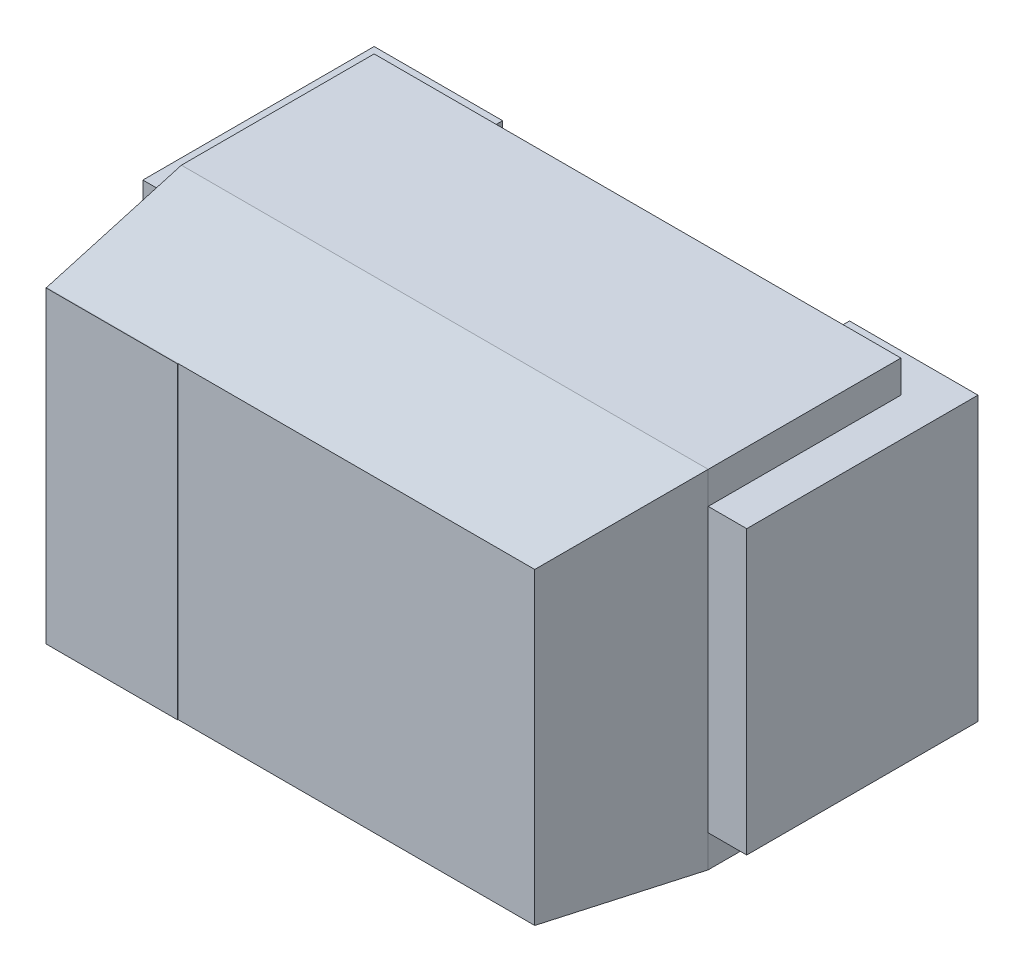
ISO-10303-21;
HEADER;
FILE_DESCRIPTION(('STEP AP214'),'2;1');
FILE_NAME('part.step','',(''),(''),'','','');
FILE_SCHEMA(('AUTOMOTIVE_DESIGN { 1 0 10303 214 1 1 1 1 }'));
ENDSEC;
DATA;
#1=APPLICATION_CONTEXT('core data for automotive mechanical design processes');
#2=APPLICATION_PROTOCOL_DEFINITION('international standard','automotive_design',2000,#1);
#3=PRODUCT_CONTEXT('',#1,'mechanical');
#4=PRODUCT('Part','Part','',(#3));
#5=PRODUCT_RELATED_PRODUCT_CATEGORY('part','',(#4));
#6=PRODUCT_DEFINITION_FORMATION('','',#4);
#7=PRODUCT_DEFINITION_CONTEXT('part definition',#1,'design');
#8=PRODUCT_DEFINITION('design','',#6,#7);
#9=PRODUCT_DEFINITION_SHAPE('','',#8);
#10=(LENGTH_UNIT() NAMED_UNIT(*) SI_UNIT(.MILLI.,.METRE.));
#11=(NAMED_UNIT(*) PLANE_ANGLE_UNIT() SI_UNIT($,.RADIAN.));
#12=(NAMED_UNIT(*) SI_UNIT($,.STERADIAN.) SOLID_ANGLE_UNIT());
#13=UNCERTAINTY_MEASURE_WITH_UNIT(LENGTH_MEASURE(1.E-05),#10,'distance_accuracy_value','');
#14=(GEOMETRIC_REPRESENTATION_CONTEXT(3) GLOBAL_UNCERTAINTY_ASSIGNED_CONTEXT((#13)) GLOBAL_UNIT_ASSIGNED_CONTEXT((#10,
#11,#12)) REPRESENTATION_CONTEXT('',''));
#15=CARTESIAN_POINT('',(0.,0.,0.));
#16=DIRECTION('',(0.,0.,1.));
#17=DIRECTION('',(1.,0.,0.));
#18=AXIS2_PLACEMENT_3D('',#15,#16,#17);
#19=CARTESIAN_POINT('',(-0.69375,0.,1.502));
#20=DIRECTION('',(0.,0.,1.));
#21=DIRECTION('',(1.,0.,0.));
#22=AXIS2_PLACEMENT_3D('',#19,#20,#21);
#23=PLANE('',#22);
#24=DIRECTION('',(1.,0.,0.));
#25=VECTOR('',#24,1.);
#26=CARTESIAN_POINT('',(-0.69375,0.6,1.502));
#27=LINE('',#26,#25);
#28=CARTESIAN_POINT('',(-0.4375,0.6,1.502));
#29=VERTEX_POINT('',#28);
#30=CARTESIAN_POINT('',(-0.95,0.6,1.502));
#31=VERTEX_POINT('',#30);
#32=EDGE_CURVE('E161',#29,#31,#27,.F.);
#33=ORIENTED_EDGE('',*,*,#32,.T.);
#34=DIRECTION('',(0.,1.,0.));
#35=VECTOR('',#34,1.);
#36=CARTESIAN_POINT('',(-0.95,0.,1.502));
#37=LINE('',#36,#35);
#38=CARTESIAN_POINT('',(-0.95,-0.6,1.502));
#39=VERTEX_POINT('',#38);
#40=EDGE_CURVE('E156',#31,#39,#37,.F.);
#41=ORIENTED_EDGE('',*,*,#40,.T.);
#42=DIRECTION('',(-1.,0.,0.));
#43=VECTOR('',#42,1.);
#44=CARTESIAN_POINT('',(-0.69375,-0.6,1.502));
#45=LINE('',#44,#43);
#46=CARTESIAN_POINT('',(-0.4375,-0.6,1.502));
#47=VERTEX_POINT('',#46);
#48=EDGE_CURVE('E171',#39,#47,#45,.F.);
#49=ORIENTED_EDGE('',*,*,#48,.T.);
#50=DIRECTION('',(0.,-1.,0.));
#51=VECTOR('',#50,1.);
#52=CARTESIAN_POINT('',(-0.4375,0.,1.502));
#53=LINE('',#52,#51);
#54=EDGE_CURVE('E20',#47,#29,#53,.F.);
#55=ORIENTED_EDGE('',*,*,#54,.T.);
#56=EDGE_LOOP('',(#33,#41,#49,#55));
#57=FACE_BOUND('',#56,.T.);
#58=ADVANCED_FACE('F17',(#57),#23,.T.);
#59=CARTESIAN_POINT('',(-0.4375,0.,1.501));
#60=DIRECTION('',(-1.,0.,0.));
#61=DIRECTION('',(0.,-1.,0.));
#62=AXIS2_PLACEMENT_3D('',#59,#60,#61);
#63=PLANE('',#62);
#64=DIRECTION('',(0.,1.,0.));
#65=VECTOR('',#64,1.);
#66=CARTESIAN_POINT('',(-0.4375,0.,1.5));
#67=LINE('',#66,#65);
#68=CARTESIAN_POINT('',(-0.4375,0.600000000000009,1.5));
#69=VERTEX_POINT('',#68);
#70=CARTESIAN_POINT('',(-0.4375,-0.600000000000009,1.5));
#71=VERTEX_POINT('',#70);
#72=EDGE_CURVE('E177',#69,#71,#67,.F.);
#73=ORIENTED_EDGE('',*,*,#72,.F.);
#74=DIRECTION('',(0.,0.,1.));
#75=VECTOR('',#74,1.);
#76=CARTESIAN_POINT('',(-0.4375,0.6,1.501));
#77=LINE('',#76,#75);
#78=EDGE_CURVE('E166',#69,#29,#77,.T.);
#79=ORIENTED_EDGE('',*,*,#78,.T.);
#80=ORIENTED_EDGE('',*,*,#54,.F.);
#81=DIRECTION('',(0.,0.,1.));
#82=VECTOR('',#81,1.);
#83=CARTESIAN_POINT('',(-0.4375,-0.6,1.501));
#84=LINE('',#83,#82);
#85=EDGE_CURVE('E184',#47,#71,#84,.F.);
#86=ORIENTED_EDGE('',*,*,#85,.T.);
#87=EDGE_LOOP('',(#73,#79,#80,#86));
#88=FACE_BOUND('',#87,.T.);
#89=ADVANCED_FACE('F176',(#88),#63,.F.);
#90=CARTESIAN_POINT('',(-0.69375,0.6,1.501));
#91=DIRECTION('',(0.,-1.,0.));
#92=DIRECTION('',(1.,0.,0.));
#93=AXIS2_PLACEMENT_3D('',#90,#91,#92);
#94=PLANE('',#93);
#95=DIRECTION('',(1.,0.,0.));
#96=VECTOR('',#95,1.);
#97=CARTESIAN_POINT('',(0.,0.600000000000074,1.50000000000001));
#98=LINE('',#97,#96);
#99=CARTESIAN_POINT('',(-0.950000000000009,0.600000000000009,1.5));
#100=VERTEX_POINT('',#99);
#101=EDGE_CURVE('E189',#100,#69,#98,.T.);
#102=ORIENTED_EDGE('',*,*,#101,.F.);
#103=DIRECTION('',(0.,0.,1.));
#104=VECTOR('',#103,1.);
#105=CARTESIAN_POINT('',(-0.95,0.6,1.501));
#106=LINE('',#105,#104);
#107=EDGE_CURVE('E168',#100,#31,#106,.T.);
#108=ORIENTED_EDGE('',*,*,#107,.T.);
#109=ORIENTED_EDGE('',*,*,#32,.F.);
#110=ORIENTED_EDGE('',*,*,#78,.F.);
#111=EDGE_LOOP('',(#102,#108,#109,#110));
#112=FACE_BOUND('',#111,.T.);
#113=ADVANCED_FACE('F164',(#112),#94,.F.);
#114=CARTESIAN_POINT('',(-0.95,0.,1.501));
#115=DIRECTION('',(1.,0.,0.));
#116=DIRECTION('',(0.,1.,0.));
#117=AXIS2_PLACEMENT_3D('',#114,#115,#116);
#118=PLANE('',#117);
#119=DIRECTION('',(0.,1.,0.));
#120=VECTOR('',#119,1.);
#121=CARTESIAN_POINT('',(-0.950000000000074,0.,1.50000000000001));
#122=LINE('',#121,#120);
#123=CARTESIAN_POINT('',(-0.950000000000009,-0.600000000000009,1.5));
#124=VERTEX_POINT('',#123);
#125=EDGE_CURVE('E199',#124,#100,#122,.T.);
#126=ORIENTED_EDGE('',*,*,#125,.F.);
#127=DIRECTION('',(0.,0.,1.));
#128=VECTOR('',#127,1.);
#129=CARTESIAN_POINT('',(-0.95,-0.6,1.501));
#130=LINE('',#129,#128);
#131=EDGE_CURVE('E186',#124,#39,#130,.T.);
#132=ORIENTED_EDGE('',*,*,#131,.T.);
#133=ORIENTED_EDGE('',*,*,#40,.F.);
#134=ORIENTED_EDGE('',*,*,#107,.F.);
#135=EDGE_LOOP('',(#126,#132,#133,#134));
#136=FACE_BOUND('',#135,.T.);
#137=ADVANCED_FACE('F469',(#136),#118,.F.);
#138=CARTESIAN_POINT('',(-0.69375,-0.6,1.501));
#139=DIRECTION('',(0.,1.,0.));
#140=DIRECTION('',(-1.,0.,0.));
#141=AXIS2_PLACEMENT_3D('',#138,#139,#140);
#142=PLANE('',#141);
#143=DIRECTION('',(1.,0.,0.));
#144=VECTOR('',#143,1.);
#145=CARTESIAN_POINT('',(0.,-0.600000000000074,1.50000000000001));
#146=LINE('',#145,#144);
#147=EDGE_CURVE('E207',#71,#124,#146,.F.);
#148=ORIENTED_EDGE('',*,*,#147,.F.);
#149=ORIENTED_EDGE('',*,*,#85,.F.);
#150=ORIENTED_EDGE('',*,*,#48,.F.);
#151=ORIENTED_EDGE('',*,*,#131,.F.);
#152=EDGE_LOOP('',(#148,#149,#150,#151));
#153=FACE_BOUND('',#152,.T.);
#154=ADVANCED_FACE('F465',(#153),#142,.F.);
#155=CARTESIAN_POINT('',(0.,0.,1.5));
#156=DIRECTION('',(0.,0.,1.));
#157=DIRECTION('',(1.,0.,0.));
#158=AXIS2_PLACEMENT_3D('',#155,#156,#157);
#159=PLANE('',#158);
#160=DIRECTION('',(0.,1.,0.));
#161=VECTOR('',#160,1.);
#162=CARTESIAN_POINT('',(0.950000000000074,0.,1.50000000000001));
#163=LINE('',#162,#161);
#164=CARTESIAN_POINT('',(0.950000000000019,0.600000000000019,1.5));
#165=VERTEX_POINT('',#164);
#166=CARTESIAN_POINT('',(0.950000000000019,-0.600000000000019,1.5));
#167=VERTEX_POINT('',#166);
#168=EDGE_CURVE('E212',#165,#167,#163,.F.);
#169=ORIENTED_EDGE('',*,*,#168,.F.);
#170=DIRECTION('',(1.,0.,0.));
#171=VECTOR('',#170,1.);
#172=CARTESIAN_POINT('',(0.,0.600000000000074,1.50000000000001));
#173=LINE('',#172,#171);
#174=EDGE_CURVE('E191',#69,#165,#173,.T.);
#175=ORIENTED_EDGE('',*,*,#174,.F.);
#176=ORIENTED_EDGE('',*,*,#72,.T.);
#177=DIRECTION('',(1.,0.,0.));
#178=VECTOR('',#177,1.);
#179=CARTESIAN_POINT('',(0.,-0.600000000000074,1.50000000000001));
#180=LINE('',#179,#178);
#181=EDGE_CURVE('E204',#167,#71,#180,.F.);
#182=ORIENTED_EDGE('',*,*,#181,.F.);
#183=EDGE_LOOP('',(#169,#175,#176,#182));
#184=FACE_BOUND('',#183,.T.);
#185=ADVANCED_FACE('F461',(#184),#159,.T.);
#186=CARTESIAN_POINT('',(0.,0.6375,1.2));
#187=DIRECTION('',(0.,0.992277876713698,0.124034734588962));
#188=DIRECTION('',(0.,-0.124034734588962,0.992277876713698));
#189=AXIS2_PLACEMENT_3D('',#186,#187,#188);
#190=PLANE('',#189);
#191=DIRECTION('',(1.,0.,0.));
#192=VECTOR('',#191,1.);
#193=CARTESIAN_POINT('',(0.,0.675,0.9));
#194=LINE('',#193,#192);
#195=CARTESIAN_POINT('',(1.02499999999996,0.674999999999991,0.899999999999994));
#196=VERTEX_POINT('',#195);
#197=CARTESIAN_POINT('',(-1.02499999999999,0.674999999999963,0.899999999999994));
#198=VERTEX_POINT('',#197);
#199=EDGE_CURVE('E231',#196,#198,#194,.F.);
#200=ORIENTED_EDGE('',*,*,#199,.T.);
#201=DIRECTION('',(-0.123091490979089,0.123091490979333,-0.984731927834692));
#202=VECTOR('',#201,1.);
#203=CARTESIAN_POINT('',(-0.950000000000074,0.6,1.50000000000001));
#204=LINE('',#203,#202);
#205=EDGE_CURVE('E202',#100,#198,#204,.T.);
#206=ORIENTED_EDGE('',*,*,#205,.F.);
#207=ORIENTED_EDGE('',*,*,#101,.T.);
#208=ORIENTED_EDGE('',*,*,#174,.T.);
#209=DIRECTION('',(-0.123091490979089,-0.123091490979333,0.984731927834692));
#210=VECTOR('',#209,1.);
#211=CARTESIAN_POINT('',(1.02499999999993,0.675,0.899999999999991));
#212=LINE('',#211,#210);
#213=EDGE_CURVE('E216',#196,#165,#212,.T.);
#214=ORIENTED_EDGE('',*,*,#213,.F.);
#215=EDGE_LOOP('',(#200,#206,#207,#208,#214));
#216=FACE_BOUND('',#215,.T.);
#217=ADVANCED_FACE('F457',(#216),#190,.T.);
#218=CARTESIAN_POINT('',(-1.175,0.55,0.));
#219=DIRECTION('',(0.,0.,1.));
#220=DIRECTION('',(1.,0.,0.));
#221=AXIS2_PLACEMENT_3D('',#218,#219,#220);
#222=PLANE('',#221);
#223=DIRECTION('',(-1.,0.,0.));
#224=VECTOR('',#223,1.);
#225=CARTESIAN_POINT('',(-0.675,0.55,0.));
#226=LINE('',#225,#224);
#227=CARTESIAN_POINT('',(-0.675,0.55,0.));
#228=VERTEX_POINT('',#227);
#229=CARTESIAN_POINT('',(-1.175,0.55,0.));
#230=VERTEX_POINT('',#229);
#231=EDGE_CURVE('E240',#228,#230,#226,.T.);
#232=ORIENTED_EDGE('',*,*,#231,.F.);
#233=DIRECTION('',(0.,1.,0.));
#234=VECTOR('',#233,1.);
#235=CARTESIAN_POINT('',(-0.675,-0.55,0.));
#236=LINE('',#235,#234);
#237=CARTESIAN_POINT('',(-0.675,-0.55,0.));
#238=VERTEX_POINT('',#237);
#239=EDGE_CURVE('E250',#238,#228,#236,.T.);
#240=ORIENTED_EDGE('',*,*,#239,.F.);
#241=DIRECTION('',(1.,0.,0.));
#242=VECTOR('',#241,1.);
#243=CARTESIAN_POINT('',(-1.175,-0.55,0.));
#244=LINE('',#243,#242);
#245=CARTESIAN_POINT('',(-1.175,-0.55,0.));
#246=VERTEX_POINT('',#245);
#247=EDGE_CURVE('E254',#246,#238,#244,.T.);
#248=ORIENTED_EDGE('',*,*,#247,.F.);
#249=DIRECTION('',(0.,-1.,0.));
#250=VECTOR('',#249,1.);
#251=CARTESIAN_POINT('',(-1.175,0.55,0.));
#252=LINE('',#251,#250);
#253=EDGE_CURVE('E193',#230,#246,#252,.T.);
#254=ORIENTED_EDGE('',*,*,#253,.F.);
#255=EDGE_LOOP('',(#232,#240,#248,#254));
#256=FACE_BOUND('',#255,.T.);
#257=ADVANCED_FACE('F453',(#256),#222,.F.);
#258=CARTESIAN_POINT('',(-1.175,0.55,0.9));
#259=DIRECTION('',(0.,0.,1.));
#260=DIRECTION('',(1.,0.,0.));
#261=AXIS2_PLACEMENT_3D('',#258,#259,#260);
#262=PLANE('',#261);
#263=DIRECTION('',(0.,1.,0.));
#264=VECTOR('',#263,1.);
#265=CARTESIAN_POINT('',(-1.02499999999993,0.,0.899999999999991));
#266=LINE('',#265,#264);
#267=CARTESIAN_POINT('',(-1.02499999999996,0.55,0.899999999999995));
#268=VERTEX_POINT('',#267);
#269=CARTESIAN_POINT('',(-1.02499999999998,-0.55,0.899999999999998));
#270=VERTEX_POINT('',#269);
#271=EDGE_CURVE('E197',#268,#270,#266,.F.);
#272=ORIENTED_EDGE('',*,*,#271,.F.);
#273=DIRECTION('',(-1.,0.,0.));
#274=VECTOR('',#273,1.);
#275=CARTESIAN_POINT('',(-0.675,0.55,0.9));
#276=LINE('',#275,#274);
#277=CARTESIAN_POINT('',(-1.175,0.55,0.9));
#278=VERTEX_POINT('',#277);
#279=EDGE_CURVE('E245',#278,#268,#276,.F.);
#280=ORIENTED_EDGE('',*,*,#279,.F.);
#281=DIRECTION('',(0.,-1.,0.));
#282=VECTOR('',#281,1.);
#283=CARTESIAN_POINT('',(-1.175,0.55,0.9));
#284=LINE('',#283,#282);
#285=CARTESIAN_POINT('',(-1.175,-0.55,0.9));
#286=VERTEX_POINT('',#285);
#287=EDGE_CURVE('E195',#286,#278,#284,.F.);
#288=ORIENTED_EDGE('',*,*,#287,.F.);
#289=DIRECTION('',(1.,0.,0.));
#290=VECTOR('',#289,1.);
#291=CARTESIAN_POINT('',(-1.175,-0.55,0.9));
#292=LINE('',#291,#290);
#293=EDGE_CURVE('E258',#270,#286,#292,.F.);
#294=ORIENTED_EDGE('',*,*,#293,.F.);
#295=EDGE_LOOP('',(#272,#280,#288,#294));
#296=FACE_BOUND('',#295,.T.);
#297=ADVANCED_FACE('F449',(#296),#262,.T.);
#298=CARTESIAN_POINT('',(-1.175,0.55,0.));
#299=DIRECTION('',(-1.,0.,0.));
#300=DIRECTION('',(0.,-1.,0.));
#301=AXIS2_PLACEMENT_3D('',#298,#299,#300);
#302=PLANE('',#301);
#303=ORIENTED_EDGE('',*,*,#287,.T.);
#304=DIRECTION('',(0.,0.,1.));
#305=VECTOR('',#304,1.);
#306=CARTESIAN_POINT('',(-1.175,0.55,0.));
#307=LINE('',#306,#305);
#308=EDGE_CURVE('E242',#230,#278,#307,.T.);
#309=ORIENTED_EDGE('',*,*,#308,.F.);
#310=ORIENTED_EDGE('',*,*,#253,.T.);
#311=DIRECTION('',(0.,0.,1.));
#312=VECTOR('',#311,1.);
#313=CARTESIAN_POINT('',(-1.175,-0.55,0.));
#314=LINE('',#313,#312);
#315=EDGE_CURVE('E260',#286,#246,#314,.F.);
#316=ORIENTED_EDGE('',*,*,#315,.F.);
#317=EDGE_LOOP('',(#303,#309,#310,#316));
#318=FACE_BOUND('',#317,.T.);
#319=ADVANCED_FACE('F445',(#318),#302,.T.);
#320=CARTESIAN_POINT('',(-0.9875,0.,1.2));
#321=DIRECTION('',(-0.992277876713698,0.,0.124034734588962));
#322=DIRECTION('',(0.124034734588962,0.,0.992277876713698));
#323=AXIS2_PLACEMENT_3D('',#320,#321,#322);
#324=PLANE('',#323);
#325=ORIENTED_EDGE('',*,*,#125,.T.);
#326=ORIENTED_EDGE('',*,*,#205,.T.);
#327=DIRECTION('',(0.,1.,0.));
#328=VECTOR('',#327,1.);
#329=CARTESIAN_POINT('',(-1.025,0.,0.9));
#330=LINE('',#329,#328);
#331=EDGE_CURVE('E237',#198,#268,#330,.F.);
#332=ORIENTED_EDGE('',*,*,#331,.T.);
#333=ORIENTED_EDGE('',*,*,#271,.T.);
#334=DIRECTION('',(0.,1.,0.));
#335=VECTOR('',#334,1.);
#336=CARTESIAN_POINT('',(-1.025,0.,0.9));
#337=LINE('',#336,#335);
#338=CARTESIAN_POINT('',(-1.02499999999996,-0.674999999999991,0.899999999999994));
#339=VERTEX_POINT('',#338);
#340=EDGE_CURVE('E263',#270,#339,#337,.F.);
#341=ORIENTED_EDGE('',*,*,#340,.T.);
#342=DIRECTION('',(-0.123091490979333,-0.123091490979089,-0.984731927834692));
#343=VECTOR('',#342,1.);
#344=CARTESIAN_POINT('',(-0.95,-0.600000000000074,1.50000000000001));
#345=LINE('',#344,#343);
#346=EDGE_CURVE('E210',#124,#339,#345,.T.);
#347=ORIENTED_EDGE('',*,*,#346,.F.);
#348=EDGE_LOOP('',(#325,#326,#332,#333,#341,#347));
#349=FACE_BOUND('',#348,.T.);
#350=ADVANCED_FACE('F441',(#349),#324,.T.);
#351=CARTESIAN_POINT('',(0.,-0.6375,1.2));
#352=DIRECTION('',(0.,-0.992277876713698,0.124034734588962));
#353=DIRECTION('',(0.,-0.124034734588962,-0.992277876713698));
#354=AXIS2_PLACEMENT_3D('',#351,#352,#353);
#355=PLANE('',#354);
#356=DIRECTION('',(-1.,0.,0.));
#357=VECTOR('',#356,1.);
#358=CARTESIAN_POINT('',(0.,-0.675,0.9));
#359=LINE('',#358,#357);
#360=CARTESIAN_POINT('',(1.02499999999999,-0.674999999999963,0.899999999999994));
#361=VERTEX_POINT('',#360);
#362=EDGE_CURVE('E272',#339,#361,#359,.F.);
#363=ORIENTED_EDGE('',*,*,#362,.T.);
#364=DIRECTION('',(0.123091490979089,-0.123091490979333,-0.984731927834692));
#365=VECTOR('',#364,1.);
#366=CARTESIAN_POINT('',(0.950000000000074,-0.6,1.50000000000001));
#367=LINE('',#366,#365);
#368=EDGE_CURVE('E214',#167,#361,#367,.T.);
#369=ORIENTED_EDGE('',*,*,#368,.F.);
#370=ORIENTED_EDGE('',*,*,#181,.T.);
#371=ORIENTED_EDGE('',*,*,#147,.T.);
#372=ORIENTED_EDGE('',*,*,#346,.T.);
#373=EDGE_LOOP('',(#363,#369,#370,#371,#372));
#374=FACE_BOUND('',#373,.T.);
#375=ADVANCED_FACE('F437',(#374),#355,.T.);
#376=CARTESIAN_POINT('',(0.9875,0.,1.2));
#377=DIRECTION('',(0.992277876713698,0.,0.124034734588962));
#378=DIRECTION('',(0.124034734588962,0.,-0.992277876713698));
#379=AXIS2_PLACEMENT_3D('',#376,#377,#378);
#380=PLANE('',#379);
#381=DIRECTION('',(0.,-1.,0.));
#382=VECTOR('',#381,1.);
#383=CARTESIAN_POINT('',(1.025,0.,0.9));
#384=LINE('',#383,#382);
#385=CARTESIAN_POINT('',(1.02499999999996,0.55,0.899999999999995));
#386=VERTEX_POINT('',#385);
#387=EDGE_CURVE('E225',#386,#196,#384,.F.);
#388=ORIENTED_EDGE('',*,*,#387,.T.);
#389=ORIENTED_EDGE('',*,*,#213,.T.);
#390=ORIENTED_EDGE('',*,*,#168,.T.);
#391=ORIENTED_EDGE('',*,*,#368,.T.);
#392=DIRECTION('',(0.,-1.,0.));
#393=VECTOR('',#392,1.);
#394=CARTESIAN_POINT('',(1.025,0.,0.9));
#395=LINE('',#394,#393);
#396=CARTESIAN_POINT('',(1.02499999999996,-0.55,0.899999999999995));
#397=VERTEX_POINT('',#396);
#398=EDGE_CURVE('E278',#361,#397,#395,.F.);
#399=ORIENTED_EDGE('',*,*,#398,.T.);
#400=DIRECTION('',(0.,1.,0.));
#401=VECTOR('',#400,1.);
#402=CARTESIAN_POINT('',(1.025,0.55,0.9));
#403=LINE('',#402,#401);
#404=EDGE_CURVE('E219',#386,#397,#403,.F.);
#405=ORIENTED_EDGE('',*,*,#404,.F.);
#406=EDGE_LOOP('',(#388,#389,#390,#391,#399,#405));
#407=FACE_BOUND('',#406,.T.);
#408=ADVANCED_FACE('F433',(#407),#380,.T.);
#409=CARTESIAN_POINT('',(1.175,0.55,0.));
#410=DIRECTION('',(0.,0.,-1.));
#411=DIRECTION('',(-1.,0.,0.));
#412=AXIS2_PLACEMENT_3D('',#409,#410,#411);
#413=PLANE('',#412);
#414=DIRECTION('',(0.,-1.,0.));
#415=VECTOR('',#414,1.);
#416=CARTESIAN_POINT('',(0.675,0.55,0.));
#417=LINE('',#416,#415);
#418=CARTESIAN_POINT('',(0.675,0.55,0.));
#419=VERTEX_POINT('',#418);
#420=CARTESIAN_POINT('',(0.675,-0.55,0.));
#421=VERTEX_POINT('',#420);
#422=EDGE_CURVE('E291',#419,#421,#417,.T.);
#423=ORIENTED_EDGE('',*,*,#422,.F.);
#424=DIRECTION('',(-1.,0.,0.));
#425=VECTOR('',#424,1.);
#426=CARTESIAN_POINT('',(1.175,0.55,0.));
#427=LINE('',#426,#425);
#428=CARTESIAN_POINT('',(1.175,0.55,0.));
#429=VERTEX_POINT('',#428);
#430=EDGE_CURVE('E295',#429,#419,#427,.T.);
#431=ORIENTED_EDGE('',*,*,#430,.F.);
#432=DIRECTION('',(0.,1.,0.));
#433=VECTOR('',#432,1.);
#434=CARTESIAN_POINT('',(1.175,-0.55,0.));
#435=LINE('',#434,#433);
#436=CARTESIAN_POINT('',(1.175,-0.55,0.));
#437=VERTEX_POINT('',#436);
#438=EDGE_CURVE('E221',#437,#429,#435,.T.);
#439=ORIENTED_EDGE('',*,*,#438,.F.);
#440=DIRECTION('',(1.,0.,0.));
#441=VECTOR('',#440,1.);
#442=CARTESIAN_POINT('',(0.675,-0.55,0.));
#443=LINE('',#442,#441);
#444=EDGE_CURVE('E281',#421,#437,#443,.T.);
#445=ORIENTED_EDGE('',*,*,#444,.F.);
#446=EDGE_LOOP('',(#423,#431,#439,#445));
#447=FACE_BOUND('',#446,.T.);
#448=ADVANCED_FACE('F429',(#447),#413,.T.);
#449=CARTESIAN_POINT('',(1.175,0.55,0.9));
#450=DIRECTION('',(0.,0.,1.));
#451=DIRECTION('',(1.,0.,0.));
#452=AXIS2_PLACEMENT_3D('',#449,#450,#451);
#453=PLANE('',#452);
#454=ORIENTED_EDGE('',*,*,#404,.T.);
#455=DIRECTION('',(1.,0.,0.));
#456=VECTOR('',#455,1.);
#457=CARTESIAN_POINT('',(0.675,-0.55,0.9));
#458=LINE('',#457,#456);
#459=CARTESIAN_POINT('',(1.175,-0.55,0.9));
#460=VERTEX_POINT('',#459);
#461=EDGE_CURVE('E286',#460,#397,#458,.F.);
#462=ORIENTED_EDGE('',*,*,#461,.F.);
#463=DIRECTION('',(0.,1.,0.));
#464=VECTOR('',#463,1.);
#465=CARTESIAN_POINT('',(1.175,-0.55,0.9));
#466=LINE('',#465,#464);
#467=CARTESIAN_POINT('',(1.175,0.55,0.9));
#468=VERTEX_POINT('',#467);
#469=EDGE_CURVE('E223',#468,#460,#466,.F.);
#470=ORIENTED_EDGE('',*,*,#469,.F.);
#471=DIRECTION('',(-1.,0.,0.));
#472=VECTOR('',#471,1.);
#473=CARTESIAN_POINT('',(1.175,0.55,0.9));
#474=LINE('',#473,#472);
#475=EDGE_CURVE('E301',#386,#468,#474,.F.);
#476=ORIENTED_EDGE('',*,*,#475,.F.);
#477=EDGE_LOOP('',(#454,#462,#470,#476));
#478=FACE_BOUND('',#477,.T.);
#479=ADVANCED_FACE('F425',(#478),#453,.T.);
#480=CARTESIAN_POINT('',(1.175,-0.55,0.));
#481=DIRECTION('',(1.,0.,0.));
#482=DIRECTION('',(0.,1.,0.));
#483=AXIS2_PLACEMENT_3D('',#480,#481,#482);
#484=PLANE('',#483);
#485=ORIENTED_EDGE('',*,*,#469,.T.);
#486=DIRECTION('',(0.,0.,1.));
#487=VECTOR('',#486,1.);
#488=CARTESIAN_POINT('',(1.175,-0.55,0.));
#489=LINE('',#488,#487);
#490=EDGE_CURVE('E283',#437,#460,#489,.T.);
#491=ORIENTED_EDGE('',*,*,#490,.F.);
#492=ORIENTED_EDGE('',*,*,#438,.T.);
#493=DIRECTION('',(0.,0.,1.));
#494=VECTOR('',#493,1.);
#495=CARTESIAN_POINT('',(1.175,0.55,0.));
#496=LINE('',#495,#494);
#497=EDGE_CURVE('E303',#468,#429,#496,.F.);
#498=ORIENTED_EDGE('',*,*,#497,.F.);
#499=EDGE_LOOP('',(#485,#491,#492,#498));
#500=FACE_BOUND('',#499,.T.);
#501=ADVANCED_FACE('F422',(#500),#484,.T.);
#502=CARTESIAN_POINT('',(1.025,0.,0.825));
#503=DIRECTION('',(-1.,0.,0.));
#504=DIRECTION('',(0.,-1.,0.));
#505=AXIS2_PLACEMENT_3D('',#502,#503,#504);
#506=PLANE('',#505);
#507=DIRECTION('',(0.,1.,0.));
#508=VECTOR('',#507,1.);
#509=CARTESIAN_POINT('',(1.025,0.,0.15));
#510=LINE('',#509,#508);
#511=CARTESIAN_POINT('',(1.025,0.55,0.15));
#512=VERTEX_POINT('',#511);
#513=CARTESIAN_POINT('',(1.025,0.675,0.15));
#514=VERTEX_POINT('',#513);
#515=EDGE_CURVE('E306',#512,#514,#510,.T.);
#516=ORIENTED_EDGE('',*,*,#515,.T.);
#517=DIRECTION('',(0.,0.,1.));
#518=VECTOR('',#517,1.);
#519=CARTESIAN_POINT('',(1.025,0.675,0.825));
#520=LINE('',#519,#518);
#521=EDGE_CURVE('E228',#514,#196,#520,.T.);
#522=ORIENTED_EDGE('',*,*,#521,.T.);
#523=ORIENTED_EDGE('',*,*,#387,.F.);
#524=DIRECTION('',(0.,0.,1.));
#525=VECTOR('',#524,1.);
#526=CARTESIAN_POINT('',(1.025,0.55,0.));
#527=LINE('',#526,#525);
#528=EDGE_CURVE('E298',#512,#386,#527,.T.);
#529=ORIENTED_EDGE('',*,*,#528,.F.);
#530=EDGE_LOOP('',(#516,#522,#523,#529));
#531=FACE_BOUND('',#530,.T.);
#532=ADVANCED_FACE('F386',(#531),#506,.F.);
#533=CARTESIAN_POINT('',(0.,0.675,0.825));
#534=DIRECTION('',(0.,-1.,0.));
#535=DIRECTION('',(1.,0.,0.));
#536=AXIS2_PLACEMENT_3D('',#533,#534,#535);
#537=PLANE('',#536);
#538=ORIENTED_EDGE('',*,*,#521,.F.);
#539=DIRECTION('',(1.,0.,0.));
#540=VECTOR('',#539,1.);
#541=CARTESIAN_POINT('',(0.,0.675,0.15));
#542=LINE('',#541,#540);
#543=CARTESIAN_POINT('',(-1.025,0.675,0.15));
#544=VERTEX_POINT('',#543);
#545=EDGE_CURVE('E309',#514,#544,#542,.F.);
#546=ORIENTED_EDGE('',*,*,#545,.T.);
#547=DIRECTION('',(0.,0.,1.));
#548=VECTOR('',#547,1.);
#549=CARTESIAN_POINT('',(-1.025,0.675,0.825));
#550=LINE('',#549,#548);
#551=EDGE_CURVE('E234',#544,#198,#550,.T.);
#552=ORIENTED_EDGE('',*,*,#551,.T.);
#553=ORIENTED_EDGE('',*,*,#199,.F.);
#554=EDGE_LOOP('',(#538,#546,#552,#553));
#555=FACE_BOUND('',#554,.T.);
#556=ADVANCED_FACE('F383',(#555),#537,.F.);
#557=CARTESIAN_POINT('',(-1.025,0.,0.825));
#558=DIRECTION('',(1.,0.,0.));
#559=DIRECTION('',(0.,1.,0.));
#560=AXIS2_PLACEMENT_3D('',#557,#558,#559);
#561=PLANE('',#560);
#562=ORIENTED_EDGE('',*,*,#331,.F.);
#563=ORIENTED_EDGE('',*,*,#551,.F.);
#564=DIRECTION('',(0.,1.,0.));
#565=VECTOR('',#564,1.);
#566=CARTESIAN_POINT('',(-1.025,0.,0.15));
#567=LINE('',#566,#565);
#568=CARTESIAN_POINT('',(-1.025,0.55,0.15));
#569=VERTEX_POINT('',#568);
#570=EDGE_CURVE('E312',#544,#569,#567,.F.);
#571=ORIENTED_EDGE('',*,*,#570,.T.);
#572=DIRECTION('',(0.,0.,1.));
#573=VECTOR('',#572,1.);
#574=CARTESIAN_POINT('',(-1.025,0.55,0.));
#575=LINE('',#574,#573);
#576=EDGE_CURVE('E248',#268,#569,#575,.F.);
#577=ORIENTED_EDGE('',*,*,#576,.F.);
#578=EDGE_LOOP('',(#562,#563,#571,#577));
#579=FACE_BOUND('',#578,.T.);
#580=ADVANCED_FACE('F380',(#579),#561,.F.);
#581=CARTESIAN_POINT('',(-0.675,0.55,0.));
#582=DIRECTION('',(0.,1.,0.));
#583=DIRECTION('',(-1.,0.,0.));
#584=AXIS2_PLACEMENT_3D('',#581,#582,#583);
#585=PLANE('',#584);
#586=DIRECTION('',(1.,0.,0.));
#587=VECTOR('',#586,1.);
#588=CARTESIAN_POINT('',(0.,0.55,0.15));
#589=LINE('',#588,#587);
#590=CARTESIAN_POINT('',(-0.675,0.55,0.15));
#591=VERTEX_POINT('',#590);
#592=EDGE_CURVE('E315',#569,#591,#589,.T.);
#593=ORIENTED_EDGE('',*,*,#592,.T.);
#594=DIRECTION('',(0.,0.,1.));
#595=VECTOR('',#594,1.);
#596=CARTESIAN_POINT('',(-0.675,0.55,0.));
#597=LINE('',#596,#595);
#598=EDGE_CURVE('E252',#228,#591,#597,.T.);
#599=ORIENTED_EDGE('',*,*,#598,.F.);
#600=ORIENTED_EDGE('',*,*,#231,.T.);
#601=ORIENTED_EDGE('',*,*,#308,.T.);
#602=ORIENTED_EDGE('',*,*,#279,.T.);
#603=ORIENTED_EDGE('',*,*,#576,.T.);
#604=EDGE_LOOP('',(#593,#599,#600,#601,#602,#603));
#605=FACE_BOUND('',#604,.T.);
#606=ADVANCED_FACE('F375',(#605),#585,.T.);
#607=CARTESIAN_POINT('',(-0.675,-0.55,0.));
#608=DIRECTION('',(1.,0.,0.));
#609=DIRECTION('',(0.,1.,0.));
#610=AXIS2_PLACEMENT_3D('',#607,#608,#609);
#611=PLANE('',#610);
#612=DIRECTION('',(0.,1.,0.));
#613=VECTOR('',#612,1.);
#614=CARTESIAN_POINT('',(-0.675,0.,0.15));
#615=LINE('',#614,#613);
#616=CARTESIAN_POINT('',(-0.675,-0.55,0.15));
#617=VERTEX_POINT('',#616);
#618=EDGE_CURVE('E318',#591,#617,#615,.F.);
#619=ORIENTED_EDGE('',*,*,#618,.T.);
#620=DIRECTION('',(0.,0.,1.));
#621=VECTOR('',#620,1.);
#622=CARTESIAN_POINT('',(-0.675,-0.55,0.));
#623=LINE('',#622,#621);
#624=EDGE_CURVE('E256',#238,#617,#623,.T.);
#625=ORIENTED_EDGE('',*,*,#624,.F.);
#626=ORIENTED_EDGE('',*,*,#239,.T.);
#627=ORIENTED_EDGE('',*,*,#598,.T.);
#628=EDGE_LOOP('',(#619,#625,#626,#627));
#629=FACE_BOUND('',#628,.T.);
#630=ADVANCED_FACE('F369',(#629),#611,.T.);
#631=CARTESIAN_POINT('',(-1.175,-0.55,0.));
#632=DIRECTION('',(0.,-1.,0.));
#633=DIRECTION('',(1.,0.,0.));
#634=AXIS2_PLACEMENT_3D('',#631,#632,#633);
#635=PLANE('',#634);
#636=ORIENTED_EDGE('',*,*,#293,.T.);
#637=ORIENTED_EDGE('',*,*,#315,.T.);
#638=ORIENTED_EDGE('',*,*,#247,.T.);
#639=ORIENTED_EDGE('',*,*,#624,.T.);
#640=DIRECTION('',(1.,0.,0.));
#641=VECTOR('',#640,1.);
#642=CARTESIAN_POINT('',(0.,-0.55,0.15));
#643=LINE('',#642,#641);
#644=CARTESIAN_POINT('',(-1.025,-0.55,0.15));
#645=VERTEX_POINT('',#644);
#646=EDGE_CURVE('E321',#617,#645,#643,.F.);
#647=ORIENTED_EDGE('',*,*,#646,.T.);
#648=DIRECTION('',(0.,0.,1.));
#649=VECTOR('',#648,1.);
#650=CARTESIAN_POINT('',(-1.025,-0.55,0.825));
#651=LINE('',#650,#649);
#652=EDGE_CURVE('E266',#645,#270,#651,.T.);
#653=ORIENTED_EDGE('',*,*,#652,.T.);
#654=EDGE_LOOP('',(#636,#637,#638,#639,#647,#653));
#655=FACE_BOUND('',#654,.T.);
#656=ADVANCED_FACE('F364',(#655),#635,.T.);
#657=CARTESIAN_POINT('',(-1.025,0.,0.825));
#658=DIRECTION('',(1.,0.,0.));
#659=DIRECTION('',(0.,1.,0.));
#660=AXIS2_PLACEMENT_3D('',#657,#658,#659);
#661=PLANE('',#660);
#662=DIRECTION('',(0.,1.,0.));
#663=VECTOR('',#662,1.);
#664=CARTESIAN_POINT('',(-1.025,0.,0.15));
#665=LINE('',#664,#663);
#666=CARTESIAN_POINT('',(-1.025,-0.675,0.15));
#667=VERTEX_POINT('',#666);
#668=EDGE_CURVE('E324',#645,#667,#665,.F.);
#669=ORIENTED_EDGE('',*,*,#668,.T.);
#670=DIRECTION('',(0.,0.,1.));
#671=VECTOR('',#670,1.);
#672=CARTESIAN_POINT('',(-1.025,-0.675,0.825));
#673=LINE('',#672,#671);
#674=EDGE_CURVE('E269',#667,#339,#673,.T.);
#675=ORIENTED_EDGE('',*,*,#674,.T.);
#676=ORIENTED_EDGE('',*,*,#340,.F.);
#677=ORIENTED_EDGE('',*,*,#652,.F.);
#678=EDGE_LOOP('',(#669,#675,#676,#677));
#679=FACE_BOUND('',#678,.T.);
#680=ADVANCED_FACE('F359',(#679),#661,.F.);
#681=CARTESIAN_POINT('',(0.,-0.675,0.825));
#682=DIRECTION('',(0.,1.,0.));
#683=DIRECTION('',(-1.,0.,0.));
#684=AXIS2_PLACEMENT_3D('',#681,#682,#683);
#685=PLANE('',#684);
#686=ORIENTED_EDGE('',*,*,#674,.F.);
#687=DIRECTION('',(1.,0.,0.));
#688=VECTOR('',#687,1.);
#689=CARTESIAN_POINT('',(0.,-0.675,0.15));
#690=LINE('',#689,#688);
#691=CARTESIAN_POINT('',(1.025,-0.675,0.15));
#692=VERTEX_POINT('',#691);
#693=EDGE_CURVE('E327',#667,#692,#690,.T.);
#694=ORIENTED_EDGE('',*,*,#693,.T.);
#695=DIRECTION('',(0.,0.,1.));
#696=VECTOR('',#695,1.);
#697=CARTESIAN_POINT('',(1.025,-0.675,0.825));
#698=LINE('',#697,#696);
#699=EDGE_CURVE('E275',#692,#361,#698,.T.);
#700=ORIENTED_EDGE('',*,*,#699,.T.);
#701=ORIENTED_EDGE('',*,*,#362,.F.);
#702=EDGE_LOOP('',(#686,#694,#700,#701));
#703=FACE_BOUND('',#702,.T.);
#704=ADVANCED_FACE('F355',(#703),#685,.F.);
#705=CARTESIAN_POINT('',(1.025,0.,0.825));
#706=DIRECTION('',(-1.,0.,0.));
#707=DIRECTION('',(0.,-1.,0.));
#708=AXIS2_PLACEMENT_3D('',#705,#706,#707);
#709=PLANE('',#708);
#710=ORIENTED_EDGE('',*,*,#398,.F.);
#711=ORIENTED_EDGE('',*,*,#699,.F.);
#712=DIRECTION('',(0.,1.,0.));
#713=VECTOR('',#712,1.);
#714=CARTESIAN_POINT('',(1.025,0.,0.15));
#715=LINE('',#714,#713);
#716=CARTESIAN_POINT('',(1.025,-0.55,0.15));
#717=VERTEX_POINT('',#716);
#718=EDGE_CURVE('E330',#692,#717,#715,.T.);
#719=ORIENTED_EDGE('',*,*,#718,.T.);
#720=DIRECTION('',(0.,0.,1.));
#721=VECTOR('',#720,1.);
#722=CARTESIAN_POINT('',(1.025,-0.55,0.));
#723=LINE('',#722,#721);
#724=EDGE_CURVE('E289',#397,#717,#723,.F.);
#725=ORIENTED_EDGE('',*,*,#724,.F.);
#726=EDGE_LOOP('',(#710,#711,#719,#725));
#727=FACE_BOUND('',#726,.T.);
#728=ADVANCED_FACE('F351',(#727),#709,.F.);
#729=CARTESIAN_POINT('',(0.675,-0.55,0.));
#730=DIRECTION('',(0.,-1.,0.));
#731=DIRECTION('',(1.,0.,0.));
#732=AXIS2_PLACEMENT_3D('',#729,#730,#731);
#733=PLANE('',#732);
#734=DIRECTION('',(1.,0.,0.));
#735=VECTOR('',#734,1.);
#736=CARTESIAN_POINT('',(0.,-0.55,0.15));
#737=LINE('',#736,#735);
#738=CARTESIAN_POINT('',(0.675,-0.55,0.15));
#739=VERTEX_POINT('',#738);
#740=EDGE_CURVE('E333',#717,#739,#737,.F.);
#741=ORIENTED_EDGE('',*,*,#740,.T.);
#742=DIRECTION('',(0.,0.,1.));
#743=VECTOR('',#742,1.);
#744=CARTESIAN_POINT('',(0.675,-0.55,0.));
#745=LINE('',#744,#743);
#746=EDGE_CURVE('E293',#421,#739,#745,.T.);
#747=ORIENTED_EDGE('',*,*,#746,.F.);
#748=ORIENTED_EDGE('',*,*,#444,.T.);
#749=ORIENTED_EDGE('',*,*,#490,.T.);
#750=ORIENTED_EDGE('',*,*,#461,.T.);
#751=ORIENTED_EDGE('',*,*,#724,.T.);
#752=EDGE_LOOP('',(#741,#747,#748,#749,#750,#751));
#753=FACE_BOUND('',#752,.T.);
#754=ADVANCED_FACE('F346',(#753),#733,.T.);
#755=CARTESIAN_POINT('',(0.675,0.55,0.));
#756=DIRECTION('',(-1.,0.,0.));
#757=DIRECTION('',(0.,-1.,0.));
#758=AXIS2_PLACEMENT_3D('',#755,#756,#757);
#759=PLANE('',#758);
#760=DIRECTION('',(0.,1.,0.));
#761=VECTOR('',#760,1.);
#762=CARTESIAN_POINT('',(0.675,0.,0.15));
#763=LINE('',#762,#761);
#764=CARTESIAN_POINT('',(0.675,0.55,0.15));
#765=VERTEX_POINT('',#764);
#766=EDGE_CURVE('E26',#739,#765,#763,.T.);
#767=ORIENTED_EDGE('',*,*,#766,.T.);
#768=DIRECTION('',(0.,0.,1.));
#769=VECTOR('',#768,1.);
#770=CARTESIAN_POINT('',(0.675,0.55,0.));
#771=LINE('',#770,#769);
#772=EDGE_CURVE('E34',#419,#765,#771,.T.);
#773=ORIENTED_EDGE('',*,*,#772,.F.);
#774=ORIENTED_EDGE('',*,*,#422,.T.);
#775=ORIENTED_EDGE('',*,*,#746,.T.);
#776=EDGE_LOOP('',(#767,#773,#774,#775));
#777=FACE_BOUND('',#776,.T.);
#778=ADVANCED_FACE('F339',(#777),#759,.T.);
#779=CARTESIAN_POINT('',(1.175,0.55,0.));
#780=DIRECTION('',(0.,1.,0.));
#781=DIRECTION('',(-1.,0.,0.));
#782=AXIS2_PLACEMENT_3D('',#779,#780,#781);
#783=PLANE('',#782);
#784=ORIENTED_EDGE('',*,*,#475,.T.);
#785=ORIENTED_EDGE('',*,*,#497,.T.);
#786=ORIENTED_EDGE('',*,*,#430,.T.);
#787=ORIENTED_EDGE('',*,*,#772,.T.);
#788=DIRECTION('',(1.,0.,0.));
#789=VECTOR('',#788,1.);
#790=CARTESIAN_POINT('',(0.,0.55,0.15));
#791=LINE('',#790,#789);
#792=EDGE_CURVE('E11',#765,#512,#791,.T.);
#793=ORIENTED_EDGE('',*,*,#792,.T.);
#794=ORIENTED_EDGE('',*,*,#528,.T.);
#795=EDGE_LOOP('',(#784,#785,#786,#787,#793,#794));
#796=FACE_BOUND('',#795,.T.);
#797=ADVANCED_FACE('F389',(#796),#783,.T.);
#798=CARTESIAN_POINT('',(0.,0.,0.15));
#799=DIRECTION('',(0.,0.,1.));
#800=DIRECTION('',(1.,0.,0.));
#801=AXIS2_PLACEMENT_3D('',#798,#799,#800);
#802=PLANE('',#801);
#803=ORIENTED_EDGE('',*,*,#766,.F.);
#804=ORIENTED_EDGE('',*,*,#740,.F.);
#805=ORIENTED_EDGE('',*,*,#718,.F.);
#806=ORIENTED_EDGE('',*,*,#693,.F.);
#807=ORIENTED_EDGE('',*,*,#668,.F.);
#808=ORIENTED_EDGE('',*,*,#646,.F.);
#809=ORIENTED_EDGE('',*,*,#618,.F.);
#810=ORIENTED_EDGE('',*,*,#592,.F.);
#811=ORIENTED_EDGE('',*,*,#570,.F.);
#812=ORIENTED_EDGE('',*,*,#545,.F.);
#813=ORIENTED_EDGE('',*,*,#515,.F.);
#814=ORIENTED_EDGE('',*,*,#792,.F.);
#815=EDGE_LOOP('',(#803,#804,#805,#806,#807,#808,#809,#810,#811,#812,#813,#814));
#816=FACE_BOUND('',#815,.T.);
#817=ADVANCED_FACE('F343',(#816),#802,.F.);
#818=CLOSED_SHELL('',(#58,#89,#113,#137,#154,#185,#217,#257,#297,#319,#350,#375,#408,#448,#479,
#501,#532,#556,#580,#606,#630,#656,#680,#704,#728,#754,#778,#797,#817));
#819=MANIFOLD_SOLID_BREP('B1',#818);
#820=ADVANCED_BREP_SHAPE_REPRESENTATION('',(#18,#819),#14);
#821=SHAPE_DEFINITION_REPRESENTATION(#9,#820);
ENDSEC;
END-ISO-10303-21;
